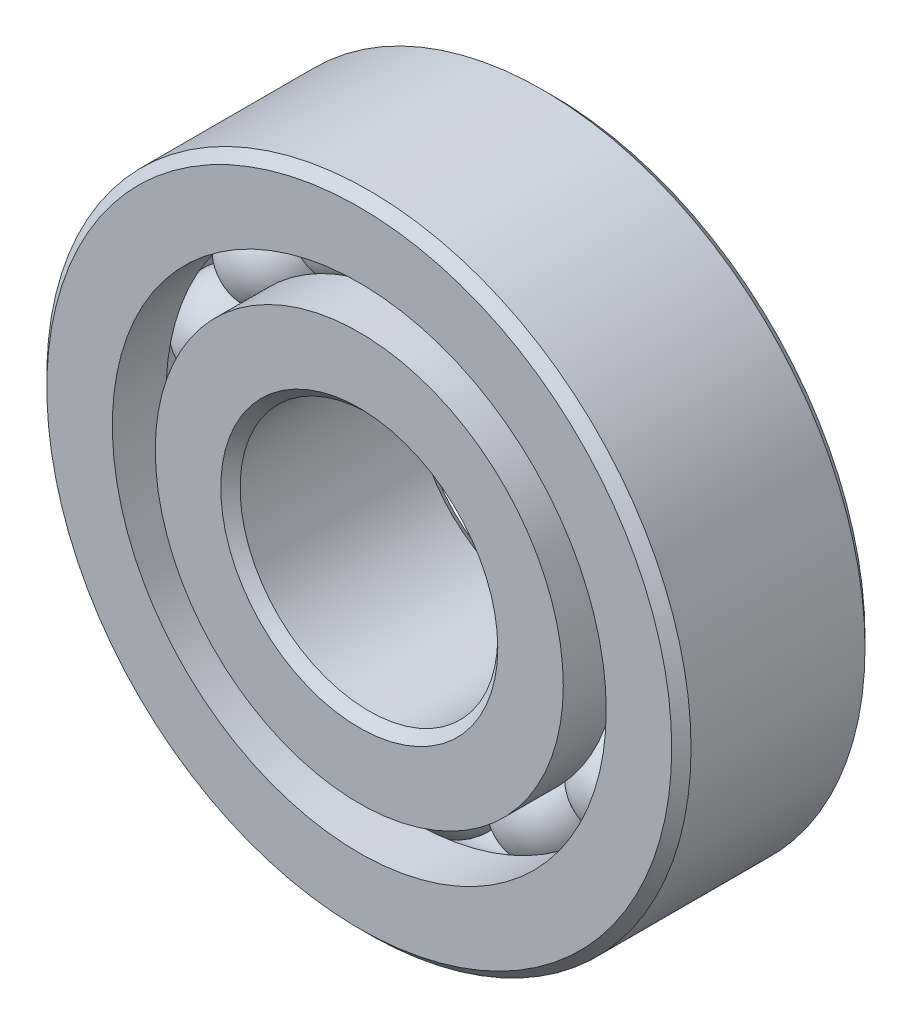
ISO-10303-21;
HEADER;
FILE_DESCRIPTION(('STEP AP214'),'2;1');
FILE_NAME('part.step','',(''),(''),'','','');
FILE_SCHEMA(('AUTOMOTIVE_DESIGN { 1 0 10303 214 1 1 1 1 }'));
ENDSEC;
DATA;
#1=APPLICATION_CONTEXT('core data for automotive mechanical design processes');
#2=APPLICATION_PROTOCOL_DEFINITION('international standard','automotive_design',2000,#1);
#3=PRODUCT_CONTEXT('',#1,'mechanical');
#4=PRODUCT('Part','Part','',(#3));
#5=PRODUCT_RELATED_PRODUCT_CATEGORY('part','',(#4));
#6=PRODUCT_DEFINITION_FORMATION('','',#4);
#7=PRODUCT_DEFINITION_CONTEXT('part definition',#1,'design');
#8=PRODUCT_DEFINITION('design','',#6,#7);
#9=PRODUCT_DEFINITION_SHAPE('','',#8);
#10=(LENGTH_UNIT() NAMED_UNIT(*) SI_UNIT(.MILLI.,.METRE.));
#11=(NAMED_UNIT(*) PLANE_ANGLE_UNIT() SI_UNIT($,.RADIAN.));
#12=(NAMED_UNIT(*) SI_UNIT($,.STERADIAN.) SOLID_ANGLE_UNIT());
#13=UNCERTAINTY_MEASURE_WITH_UNIT(LENGTH_MEASURE(1.E-05),#10,'distance_accuracy_value','');
#14=(GEOMETRIC_REPRESENTATION_CONTEXT(3) GLOBAL_UNCERTAINTY_ASSIGNED_CONTEXT((#13)) GLOBAL_UNIT_ASSIGNED_CONTEXT((#10,
#11,#12)) REPRESENTATION_CONTEXT('',''));
#15=CARTESIAN_POINT('',(0.,0.,0.));
#16=DIRECTION('',(0.,0.,1.));
#17=DIRECTION('',(1.,0.,0.));
#18=AXIS2_PLACEMENT_3D('',#15,#16,#17);
#19=CARTESIAN_POINT('',(-0.759296543455706,1.57669551882924,0.));
#20=DIRECTION('',(0.,0.,1.));
#21=DIRECTION('',(-0.433883739117546,0.900968867902425,0.));
#22=AXIS2_PLACEMENT_3D('',#19,#20,#21);
#23=SPHERICAL_SURFACE('',#22,0.372677996249965);
#24=CARTESIAN_POINT('',(-0.759296543455706,1.57669551882924,0.372677996249965));
#25=VERTEX_POINT('',#24);
#26=VERTEX_LOOP('',#25);
#27=FACE_BOUND('',#26,.T.);
#28=ADVANCED_FACE('F41',(#27),#23,.T.);
#29=CLOSED_SHELL('',(#28));
#30=MANIFOLD_SOLID_BREP('B2',#29);
#31=CARTESIAN_POINT('',(-1.36820509431904,1.0911071532528,0.));
#32=DIRECTION('',(0.,0.,1.));
#33=DIRECTION('',(-0.781831482468022,0.623489801858743,0.));
#34=AXIS2_PLACEMENT_3D('',#31,#32,#33);
#35=SPHERICAL_SURFACE('',#34,0.372677996249965);
#36=CARTESIAN_POINT('',(-1.36820509431904,1.0911071532528,0.372677996249965));
#37=VERTEX_POINT('',#36);
#38=VERTEX_LOOP('',#37);
#39=FACE_BOUND('',#38,.T.);
#40=ADVANCED_FACE('F76',(#39),#35,.T.);
#41=CLOSED_SHELL('',(#40));
#42=MANIFOLD_SOLID_BREP('B6',#41);
#43=CARTESIAN_POINT('',(-1.70612384631819,0.389411634423568,0.));
#44=DIRECTION('',(0.,0.,1.));
#45=DIRECTION('',(-0.974927912181821,0.222520933956325,0.));
#46=AXIS2_PLACEMENT_3D('',#43,#44,#45);
#47=SPHERICAL_SURFACE('',#46,0.372677996249965);
#48=CARTESIAN_POINT('',(-1.70612384631819,0.389411634423568,0.372677996249965));
#49=VERTEX_POINT('',#48);
#50=VERTEX_LOOP('',#49);
#51=FACE_BOUND('',#50,.T.);
#52=ADVANCED_FACE('F111',(#51),#47,.T.);
#53=CLOSED_SHELL('',(#52));
#54=MANIFOLD_SOLID_BREP('B37',#53);
#55=CARTESIAN_POINT('',(-1.7061238463182,-0.389411634423534,0.));
#56=DIRECTION('',(0.,0.,1.));
#57=DIRECTION('',(-0.974927912181826,-0.222520933956305,0.));
#58=AXIS2_PLACEMENT_3D('',#55,#56,#57);
#59=SPHERICAL_SURFACE('',#58,0.372677996249965);
#60=CARTESIAN_POINT('',(-1.7061238463182,-0.389411634423534,0.372677996249965));
#61=VERTEX_POINT('',#60);
#62=VERTEX_LOOP('',#61);
#63=FACE_BOUND('',#62,.T.);
#64=ADVANCED_FACE('F146',(#63),#59,.T.);
#65=CLOSED_SHELL('',(#64));
#66=MANIFOLD_SOLID_BREP('B72',#65);
#67=CARTESIAN_POINT('',(-1.36820509431906,-1.09110715325277,0.));
#68=DIRECTION('',(0.,0.,1.));
#69=DIRECTION('',(-0.781831482468035,-0.623489801858727,0.));
#70=AXIS2_PLACEMENT_3D('',#67,#68,#69);
#71=SPHERICAL_SURFACE('',#70,0.372677996249965);
#72=CARTESIAN_POINT('',(-1.36820509431906,-1.09110715325277,0.372677996249965));
#73=VERTEX_POINT('',#72);
#74=VERTEX_LOOP('',#73);
#75=FACE_BOUND('',#74,.T.);
#76=ADVANCED_FACE('F181',(#75),#71,.T.);
#77=CLOSED_SHELL('',(#76));
#78=MANIFOLD_SOLID_BREP('B107',#77);
#79=CARTESIAN_POINT('',(-0.759296543455739,-1.57669551882923,0.));
#80=DIRECTION('',(0.,0.,1.));
#81=DIRECTION('',(-0.433883739117565,-0.900968867902416,0.));
#82=AXIS2_PLACEMENT_3D('',#79,#80,#81);
#83=SPHERICAL_SURFACE('',#82,0.372677996249965);
#84=CARTESIAN_POINT('',(-0.759296543455739,-1.57669551882923,0.372677996249965));
#85=VERTEX_POINT('',#84);
#86=VERTEX_LOOP('',#85);
#87=FACE_BOUND('',#86,.T.);
#88=ADVANCED_FACE('F216',(#87),#83,.T.);
#89=CLOSED_SHELL('',(#88));
#90=MANIFOLD_SOLID_BREP('B142',#89);
#91=CARTESIAN_POINT('',(0.,-1.75,0.));
#92=DIRECTION('',(0.,0.,1.));
#93=DIRECTION('',(0.,-1.,0.));
#94=AXIS2_PLACEMENT_3D('',#91,#92,#93);
#95=SPHERICAL_SURFACE('',#94,0.372677996249965);
#96=CARTESIAN_POINT('',(0.,-1.75,0.372677996249965));
#97=VERTEX_POINT('',#96);
#98=VERTEX_LOOP('',#97);
#99=FACE_BOUND('',#98,.T.);
#100=ADVANCED_FACE('F251',(#99),#95,.T.);
#101=CLOSED_SHELL('',(#100));
#102=MANIFOLD_SOLID_BREP('B177',#101);
#103=CARTESIAN_POINT('',(0.759296543455717,-1.57669551882924,0.));
#104=DIRECTION('',(0.,0.,1.));
#105=DIRECTION('',(0.433883739117553,-0.900968867902422,0.));
#106=AXIS2_PLACEMENT_3D('',#103,#104,#105);
#107=SPHERICAL_SURFACE('',#106,0.372677996249965);
#108=CARTESIAN_POINT('',(0.759296543455717,-1.57669551882924,0.372677996249965));
#109=VERTEX_POINT('',#108);
#110=VERTEX_LOOP('',#109);
#111=FACE_BOUND('',#110,.T.);
#112=ADVANCED_FACE('F286',(#111),#107,.T.);
#113=CLOSED_SHELL('',(#112));
#114=MANIFOLD_SOLID_BREP('B212',#113);
#115=CARTESIAN_POINT('',(1.36820509431905,-1.09110715325279,0.));
#116=DIRECTION('',(0.,0.,1.));
#117=DIRECTION('',(0.781831482468027,-0.623489801858737,0.));
#118=AXIS2_PLACEMENT_3D('',#115,#116,#117);
#119=SPHERICAL_SURFACE('',#118,0.372677996249965);
#120=CARTESIAN_POINT('',(1.36820509431905,-1.09110715325279,0.372677996249965));
#121=VERTEX_POINT('',#120);
#122=VERTEX_LOOP('',#121);
#123=FACE_BOUND('',#122,.T.);
#124=ADVANCED_FACE('F321',(#123),#119,.T.);
#125=CLOSED_SHELL('',(#124));
#126=MANIFOLD_SOLID_BREP('B247',#125);
#127=CARTESIAN_POINT('',(1.70612384631819,-0.389411634423557,0.));
#128=DIRECTION('',(0.,0.,1.));
#129=DIRECTION('',(0.974927912181823,-0.222520933956318,0.));
#130=AXIS2_PLACEMENT_3D('',#127,#128,#129);
#131=SPHERICAL_SURFACE('',#130,0.372677996249965);
#132=CARTESIAN_POINT('',(1.70612384631819,-0.389411634423557,0.372677996249965));
#133=VERTEX_POINT('',#132);
#134=VERTEX_LOOP('',#133);
#135=FACE_BOUND('',#134,.T.);
#136=ADVANCED_FACE('F356',(#135),#131,.T.);
#137=CLOSED_SHELL('',(#136));
#138=MANIFOLD_SOLID_BREP('B282',#137);
#139=CARTESIAN_POINT('',(1.70612384631819,0.389411634423545,0.));
#140=DIRECTION('',(0.,0.,1.));
#141=DIRECTION('',(0.974927912181824,0.222520933956311,0.));
#142=AXIS2_PLACEMENT_3D('',#139,#140,#141);
#143=SPHERICAL_SURFACE('',#142,0.372677996249965);
#144=CARTESIAN_POINT('',(1.70612384631819,0.389411634423545,0.372677996249965));
#145=VERTEX_POINT('',#144);
#146=VERTEX_LOOP('',#145);
#147=FACE_BOUND('',#146,.T.);
#148=ADVANCED_FACE('F391',(#147),#143,.T.);
#149=CLOSED_SHELL('',(#148));
#150=MANIFOLD_SOLID_BREP('B317',#149);
#151=CARTESIAN_POINT('',(1.36820509431905,1.09110715325278,0.));
#152=DIRECTION('',(0.,0.,1.));
#153=DIRECTION('',(0.781831482468031,0.623489801858732,0.));
#154=AXIS2_PLACEMENT_3D('',#151,#152,#153);
#155=SPHERICAL_SURFACE('',#154,0.372677996249965);
#156=CARTESIAN_POINT('',(1.36820509431905,1.09110715325278,0.372677996249965));
#157=VERTEX_POINT('',#156);
#158=VERTEX_LOOP('',#157);
#159=FACE_BOUND('',#158,.T.);
#160=ADVANCED_FACE('F426',(#159),#155,.T.);
#161=CLOSED_SHELL('',(#160));
#162=MANIFOLD_SOLID_BREP('B352',#161);
#163=CARTESIAN_POINT('',(0.759296543455728,1.57669551882923,0.));
#164=DIRECTION('',(0.,0.,1.));
#165=DIRECTION('',(0.433883739117559,0.900968867902419,0.));
#166=AXIS2_PLACEMENT_3D('',#163,#164,#165);
#167=SPHERICAL_SURFACE('',#166,0.372677996249965);
#168=CARTESIAN_POINT('',(0.759296543455728,1.57669551882923,0.372677996249965));
#169=VERTEX_POINT('',#168);
#170=VERTEX_LOOP('',#169);
#171=FACE_BOUND('',#170,.T.);
#172=ADVANCED_FACE('F461',(#171),#167,.T.);
#173=CLOSED_SHELL('',(#172));
#174=MANIFOLD_SOLID_BREP('B387',#173);
#175=CARTESIAN_POINT('',(0.,1.75,0.));
#176=DIRECTION('',(0.,0.,1.));
#177=DIRECTION('',(0.,1.,0.));
#178=AXIS2_PLACEMENT_3D('',#175,#176,#177);
#179=SPHERICAL_SURFACE('',#178,0.372677996249965);
#180=CARTESIAN_POINT('',(0.,1.75,0.372677996249965));
#181=VERTEX_POINT('',#180);
#182=VERTEX_LOOP('',#181);
#183=FACE_BOUND('',#182,.T.);
#184=ADVANCED_FACE('F498',(#183),#179,.T.);
#185=CLOSED_SHELL('',(#184));
#186=MANIFOLD_SOLID_BREP('B422',#185);
#187=CARTESIAN_POINT('',(0.,1.58333333333333,0.75));
#188=DIRECTION('',(0.,0.,-1.));
#189=DIRECTION('',(-1.,0.,0.));
#190=AXIS2_PLACEMENT_3D('',#187,#188,#189);
#191=PLANE('',#190);
#192=CARTESIAN_POINT('',(0.,0.,0.75));
#193=DIRECTION('',(0.,0.,1.));
#194=DIRECTION('',(1.,0.,0.));
#195=AXIS2_PLACEMENT_3D('',#192,#193,#194);
#196=CIRCLE('',#195,1.075);
#197=CARTESIAN_POINT('',(1.075,0.,0.75));
#198=VERTEX_POINT('',#197);
#199=EDGE_CURVE('E497',#198,#198,#196,.T.);
#200=ORIENTED_EDGE('',*,*,#199,.F.);
#201=EDGE_LOOP('',(#200));
#202=FACE_BOUND('',#201,.T.);
#203=CARTESIAN_POINT('',(0.,0.,0.750000000000001));
#204=DIRECTION('',(0.,0.,1.));
#205=DIRECTION('',(1.,0.,0.));
#206=AXIS2_PLACEMENT_3D('',#203,#204,#205);
#207=CIRCLE('',#206,1.58333333333333);
#208=CARTESIAN_POINT('',(1.58333333333333,0.,0.750000000000001));
#209=VERTEX_POINT('',#208);
#210=EDGE_CURVE('E545',#209,#209,#207,.T.);
#211=ORIENTED_EDGE('',*,*,#210,.T.);
#212=EDGE_LOOP('',(#211));
#213=FACE_BOUND('',#212,.T.);
#214=ADVANCED_FACE('F517',(#202,#213),#191,.F.);
#215=CARTESIAN_POINT('',(0.,0.,0.75));
#216=DIRECTION('',(0.,0.,1.));
#217=DIRECTION('',(1.,0.,0.));
#218=AXIS2_PLACEMENT_3D('',#215,#216,#217);
#219=CONICAL_SURFACE('',#218,1.075,0.785398163397447);
#220=CARTESIAN_POINT('',(0.,0.,0.675));
#221=DIRECTION('',(0.,0.,1.));
#222=DIRECTION('',(1.,0.,0.));
#223=AXIS2_PLACEMENT_3D('',#220,#221,#222);
#224=CIRCLE('',#223,1.);
#225=CARTESIAN_POINT('',(1.,0.,0.675));
#226=VERTEX_POINT('',#225);
#227=EDGE_CURVE('E523',#226,#226,#224,.T.);
#228=ORIENTED_EDGE('',*,*,#227,.F.);
#229=EDGE_LOOP('',(#228));
#230=FACE_BOUND('',#229,.T.);
#231=ORIENTED_EDGE('',*,*,#199,.T.);
#232=EDGE_LOOP('',(#231));
#233=FACE_BOUND('',#232,.T.);
#234=ADVANCED_FACE('F582',(#230,#233),#219,.F.);
#235=CARTESIAN_POINT('',(0.,0.,0.75));
#236=DIRECTION('',(0.,0.,1.));
#237=DIRECTION('',(1.,0.,0.));
#238=AXIS2_PLACEMENT_3D('',#235,#236,#237);
#239=CYLINDRICAL_SURFACE('',#238,1.);
#240=CARTESIAN_POINT('',(0.,0.,-0.675));
#241=DIRECTION('',(0.,0.,1.));
#242=DIRECTION('',(1.,0.,0.));
#243=AXIS2_PLACEMENT_3D('',#240,#241,#242);
#244=CIRCLE('',#243,1.);
#245=CARTESIAN_POINT('',(1.,0.,-0.675));
#246=VERTEX_POINT('',#245);
#247=EDGE_CURVE('E527',#246,#246,#244,.T.);
#248=ORIENTED_EDGE('',*,*,#247,.F.);
#249=EDGE_LOOP('',(#248));
#250=FACE_BOUND('',#249,.T.);
#251=ORIENTED_EDGE('',*,*,#227,.T.);
#252=EDGE_LOOP('',(#251));
#253=FACE_BOUND('',#252,.T.);
#254=ADVANCED_FACE('F577',(#250,#253),#239,.F.);
#255=CARTESIAN_POINT('',(0.,0.,-0.675));
#256=DIRECTION('',(0.,0.,-1.));
#257=DIRECTION('',(-1.,0.,0.));
#258=AXIS2_PLACEMENT_3D('',#255,#256,#257);
#259=CONICAL_SURFACE('',#258,1.,0.785398163397447);
#260=CARTESIAN_POINT('',(0.,0.,-0.75));
#261=DIRECTION('',(0.,0.,1.));
#262=DIRECTION('',(1.,0.,0.));
#263=AXIS2_PLACEMENT_3D('',#260,#261,#262);
#264=CIRCLE('',#263,1.075);
#265=CARTESIAN_POINT('',(1.075,0.,-0.75));
#266=VERTEX_POINT('',#265);
#267=EDGE_CURVE('E531',#266,#266,#264,.T.);
#268=ORIENTED_EDGE('',*,*,#267,.F.);
#269=EDGE_LOOP('',(#268));
#270=FACE_BOUND('',#269,.T.);
#271=ORIENTED_EDGE('',*,*,#247,.T.);
#272=EDGE_LOOP('',(#271));
#273=FACE_BOUND('',#272,.T.);
#274=ADVANCED_FACE('F571',(#270,#273),#259,.F.);
#275=CARTESIAN_POINT('',(0.,1.58333333333333,-0.75));
#276=DIRECTION('',(0.,0.,1.));
#277=DIRECTION('',(1.,0.,0.));
#278=AXIS2_PLACEMENT_3D('',#275,#276,#277);
#279=PLANE('',#278);
#280=CARTESIAN_POINT('',(0.,0.,-0.75));
#281=DIRECTION('',(0.,0.,1.));
#282=DIRECTION('',(1.,0.,0.));
#283=AXIS2_PLACEMENT_3D('',#280,#281,#282);
#284=CIRCLE('',#283,1.58333333333333);
#285=CARTESIAN_POINT('',(1.58333333333333,0.,-0.75));
#286=VERTEX_POINT('',#285);
#287=EDGE_CURVE('E536',#286,#286,#284,.T.);
#288=ORIENTED_EDGE('',*,*,#287,.F.);
#289=EDGE_LOOP('',(#288));
#290=FACE_BOUND('',#289,.T.);
#291=ORIENTED_EDGE('',*,*,#267,.T.);
#292=EDGE_LOOP('',(#291));
#293=FACE_BOUND('',#292,.T.);
#294=ADVANCED_FACE('F565',(#290,#293),#279,.F.);
#295=CARTESIAN_POINT('',(0.,0.,0.75));
#296=DIRECTION('',(0.,0.,1.));
#297=DIRECTION('',(1.,0.,0.));
#298=AXIS2_PLACEMENT_3D('',#295,#296,#297);
#299=CYLINDRICAL_SURFACE('',#298,1.58333333333333);
#300=CARTESIAN_POINT('',(0.,0.,-0.333333333333333));
#301=DIRECTION('',(0.,0.,1.));
#302=DIRECTION('',(1.,0.,0.));
#303=AXIS2_PLACEMENT_3D('',#300,#301,#302);
#304=CIRCLE('',#303,1.58333333333333);
#305=CARTESIAN_POINT('',(1.58333333333333,0.,-0.333333333333333));
#306=VERTEX_POINT('',#305);
#307=EDGE_CURVE('E539',#306,#306,#304,.T.);
#308=ORIENTED_EDGE('',*,*,#307,.F.);
#309=EDGE_LOOP('',(#308));
#310=FACE_BOUND('',#309,.T.);
#311=ORIENTED_EDGE('',*,*,#287,.T.);
#312=EDGE_LOOP('',(#311));
#313=FACE_BOUND('',#312,.T.);
#314=ADVANCED_FACE('F559',(#310,#313),#299,.T.);
#315=CARTESIAN_POINT('',(0.,0.,0.));
#316=DIRECTION('',(0.,0.,1.));
#317=DIRECTION('',(1.,0.,0.));
#318=AXIS2_PLACEMENT_3D('',#315,#316,#317);
#319=TOROIDAL_SURFACE('',#318,1.75,0.372677996249965);
#320=CARTESIAN_POINT('',(0.,0.,0.333333333333333));
#321=DIRECTION('',(0.,0.,1.));
#322=DIRECTION('',(1.,0.,0.));
#323=AXIS2_PLACEMENT_3D('',#320,#321,#322);
#324=CIRCLE('',#323,1.58333333333333);
#325=CARTESIAN_POINT('',(1.58333333333333,0.,0.333333333333333));
#326=VERTEX_POINT('',#325);
#327=EDGE_CURVE('E542',#326,#326,#324,.T.);
#328=ORIENTED_EDGE('',*,*,#327,.F.);
#329=EDGE_LOOP('',(#328));
#330=FACE_BOUND('',#329,.T.);
#331=ORIENTED_EDGE('',*,*,#307,.T.);
#332=EDGE_LOOP('',(#331));
#333=FACE_BOUND('',#332,.T.);
#334=ADVANCED_FACE('F553',(#330,#333),#319,.F.);
#335=CARTESIAN_POINT('',(0.,0.,0.75));
#336=DIRECTION('',(0.,0.,1.));
#337=DIRECTION('',(1.,0.,0.));
#338=AXIS2_PLACEMENT_3D('',#335,#336,#337);
#339=CYLINDRICAL_SURFACE('',#338,1.58333333333333);
#340=ORIENTED_EDGE('',*,*,#210,.F.);
#341=EDGE_LOOP('',(#340));
#342=FACE_BOUND('',#341,.T.);
#343=ORIENTED_EDGE('',*,*,#327,.T.);
#344=EDGE_LOOP('',(#343));
#345=FACE_BOUND('',#344,.T.);
#346=ADVANCED_FACE('F550',(#342,#345),#339,.T.);
#347=CLOSED_SHELL('',(#214,#234,#254,#274,#294,#314,#334,#346));
#348=MANIFOLD_SOLID_BREP('B457',#347);
#349=CARTESIAN_POINT('',(0.,0.,0.675));
#350=DIRECTION('',(0.,0.,-1.));
#351=DIRECTION('',(-1.,0.,0.));
#352=AXIS2_PLACEMENT_3D('',#349,#350,#351);
#353=CONICAL_SURFACE('',#352,2.5,0.785398163397448);
#354=CARTESIAN_POINT('',(0.,0.,0.75));
#355=DIRECTION('',(0.,0.,1.));
#356=DIRECTION('',(1.,0.,0.));
#357=AXIS2_PLACEMENT_3D('',#354,#355,#356);
#358=CIRCLE('',#357,2.425);
#359=CARTESIAN_POINT('',(2.425,0.,0.75));
#360=VERTEX_POINT('',#359);
#361=EDGE_CURVE('E666',#360,#360,#358,.T.);
#362=ORIENTED_EDGE('',*,*,#361,.F.);
#363=EDGE_LOOP('',(#362));
#364=FACE_BOUND('',#363,.T.);
#365=CARTESIAN_POINT('',(0.,0.,0.675));
#366=DIRECTION('',(0.,0.,1.));
#367=DIRECTION('',(1.,0.,0.));
#368=AXIS2_PLACEMENT_3D('',#365,#366,#367);
#369=CIRCLE('',#368,2.5);
#370=CARTESIAN_POINT('',(2.5,0.,0.675));
#371=VERTEX_POINT('',#370);
#372=EDGE_CURVE('E516',#371,#371,#369,.T.);
#373=ORIENTED_EDGE('',*,*,#372,.T.);
#374=EDGE_LOOP('',(#373));
#375=FACE_BOUND('',#374,.T.);
#376=ADVANCED_FACE('F638',(#364,#375),#353,.T.);
#377=CARTESIAN_POINT('',(0.,0.,0.75));
#378=DIRECTION('',(0.,0.,1.));
#379=DIRECTION('',(1.,0.,0.));
#380=AXIS2_PLACEMENT_3D('',#377,#378,#379);
#381=CYLINDRICAL_SURFACE('',#380,2.5);
#382=ORIENTED_EDGE('',*,*,#372,.F.);
#383=EDGE_LOOP('',(#382));
#384=FACE_BOUND('',#383,.T.);
#385=CARTESIAN_POINT('',(0.,0.,-0.675));
#386=DIRECTION('',(0.,0.,1.));
#387=DIRECTION('',(1.,0.,0.));
#388=AXIS2_PLACEMENT_3D('',#385,#386,#387);
#389=CIRCLE('',#388,2.5);
#390=CARTESIAN_POINT('',(2.5,0.,-0.675));
#391=VERTEX_POINT('',#390);
#392=EDGE_CURVE('E644',#391,#391,#389,.T.);
#393=ORIENTED_EDGE('',*,*,#392,.T.);
#394=EDGE_LOOP('',(#393));
#395=FACE_BOUND('',#394,.T.);
#396=ADVANCED_FACE('F673',(#384,#395),#381,.T.);
#397=CARTESIAN_POINT('',(0.,0.,-0.750000000000001));
#398=DIRECTION('',(0.,0.,1.));
#399=DIRECTION('',(1.,0.,0.));
#400=AXIS2_PLACEMENT_3D('',#397,#398,#399);
#401=CONICAL_SURFACE('',#400,2.425,0.785398163397447);
#402=ORIENTED_EDGE('',*,*,#392,.F.);
#403=EDGE_LOOP('',(#402));
#404=FACE_BOUND('',#403,.T.);
#405=CARTESIAN_POINT('',(0.,0.,-0.750000000000001));
#406=DIRECTION('',(0.,0.,1.));
#407=DIRECTION('',(1.,0.,0.));
#408=AXIS2_PLACEMENT_3D('',#405,#406,#407);
#409=CIRCLE('',#408,2.425);
#410=CARTESIAN_POINT('',(2.425,0.,-0.750000000000001));
#411=VERTEX_POINT('',#410);
#412=EDGE_CURVE('E648',#411,#411,#409,.T.);
#413=ORIENTED_EDGE('',*,*,#412,.T.);
#414=EDGE_LOOP('',(#413));
#415=FACE_BOUND('',#414,.T.);
#416=ADVANCED_FACE('F677',(#404,#415),#401,.T.);
#417=CARTESIAN_POINT('',(0.,2.425,-0.750000000000001));
#418=DIRECTION('',(0.,0.,1.));
#419=DIRECTION('',(1.,0.,0.));
#420=AXIS2_PLACEMENT_3D('',#417,#418,#419);
#421=PLANE('',#420);
#422=ORIENTED_EDGE('',*,*,#412,.F.);
#423=EDGE_LOOP('',(#422));
#424=FACE_BOUND('',#423,.T.);
#425=CARTESIAN_POINT('',(0.,0.,-0.75));
#426=DIRECTION('',(0.,0.,1.));
#427=DIRECTION('',(1.,0.,0.));
#428=AXIS2_PLACEMENT_3D('',#425,#426,#427);
#429=CIRCLE('',#428,1.91666666666667);
#430=CARTESIAN_POINT('',(1.91666666666667,0.,-0.75));
#431=VERTEX_POINT('',#430);
#432=EDGE_CURVE('E652',#431,#431,#429,.T.);
#433=ORIENTED_EDGE('',*,*,#432,.T.);
#434=EDGE_LOOP('',(#433));
#435=FACE_BOUND('',#434,.T.);
#436=ADVANCED_FACE('F682',(#424,#435),#421,.F.);
#437=CARTESIAN_POINT('',(0.,0.,0.75));
#438=DIRECTION('',(0.,0.,1.));
#439=DIRECTION('',(1.,0.,0.));
#440=AXIS2_PLACEMENT_3D('',#437,#438,#439);
#441=CYLINDRICAL_SURFACE('',#440,1.91666666666667);
#442=ORIENTED_EDGE('',*,*,#432,.F.);
#443=EDGE_LOOP('',(#442));
#444=FACE_BOUND('',#443,.T.);
#445=CARTESIAN_POINT('',(0.,0.,-0.333333333333333));
#446=DIRECTION('',(0.,0.,1.));
#447=DIRECTION('',(1.,0.,0.));
#448=AXIS2_PLACEMENT_3D('',#445,#446,#447);
#449=CIRCLE('',#448,1.91666666666667);
#450=CARTESIAN_POINT('',(1.91666666666667,0.,-0.333333333333333));
#451=VERTEX_POINT('',#450);
#452=EDGE_CURVE('E657',#451,#451,#449,.T.);
#453=ORIENTED_EDGE('',*,*,#452,.T.);
#454=EDGE_LOOP('',(#453));
#455=FACE_BOUND('',#454,.T.);
#456=ADVANCED_FACE('F688',(#444,#455),#441,.F.);
#457=CARTESIAN_POINT('',(0.,0.,0.));
#458=DIRECTION('',(0.,0.,1.));
#459=DIRECTION('',(1.,0.,0.));
#460=AXIS2_PLACEMENT_3D('',#457,#458,#459);
#461=TOROIDAL_SURFACE('',#460,1.75,0.372677996249965);
#462=ORIENTED_EDGE('',*,*,#452,.F.);
#463=EDGE_LOOP('',(#462));
#464=FACE_BOUND('',#463,.T.);
#465=CARTESIAN_POINT('',(0.,0.,0.333333333333333));
#466=DIRECTION('',(0.,0.,1.));
#467=DIRECTION('',(1.,0.,0.));
#468=AXIS2_PLACEMENT_3D('',#465,#466,#467);
#469=CIRCLE('',#468,1.91666666666667);
#470=CARTESIAN_POINT('',(1.91666666666667,0.,0.333333333333333));
#471=VERTEX_POINT('',#470);
#472=EDGE_CURVE('E660',#471,#471,#469,.T.);
#473=ORIENTED_EDGE('',*,*,#472,.T.);
#474=EDGE_LOOP('',(#473));
#475=FACE_BOUND('',#474,.T.);
#476=ADVANCED_FACE('F692',(#464,#475),#461,.F.);
#477=CARTESIAN_POINT('',(0.,0.,0.75));
#478=DIRECTION('',(0.,0.,1.));
#479=DIRECTION('',(1.,0.,0.));
#480=AXIS2_PLACEMENT_3D('',#477,#478,#479);
#481=CYLINDRICAL_SURFACE('',#480,1.91666666666667);
#482=ORIENTED_EDGE('',*,*,#472,.F.);
#483=EDGE_LOOP('',(#482));
#484=FACE_BOUND('',#483,.T.);
#485=CARTESIAN_POINT('',(0.,0.,0.75));
#486=DIRECTION('',(0.,0.,1.));
#487=DIRECTION('',(1.,0.,0.));
#488=AXIS2_PLACEMENT_3D('',#485,#486,#487);
#489=CIRCLE('',#488,1.91666666666667);
#490=CARTESIAN_POINT('',(1.91666666666667,0.,0.75));
#491=VERTEX_POINT('',#490);
#492=EDGE_CURVE('E663',#491,#491,#489,.T.);
#493=ORIENTED_EDGE('',*,*,#492,.T.);
#494=EDGE_LOOP('',(#493));
#495=FACE_BOUND('',#494,.T.);
#496=ADVANCED_FACE('F696',(#484,#495),#481,.F.);
#497=CARTESIAN_POINT('',(0.,2.425,0.75));
#498=DIRECTION('',(0.,0.,-1.));
#499=DIRECTION('',(-1.,0.,0.));
#500=AXIS2_PLACEMENT_3D('',#497,#498,#499);
#501=PLANE('',#500);
#502=ORIENTED_EDGE('',*,*,#492,.F.);
#503=EDGE_LOOP('',(#502));
#504=FACE_BOUND('',#503,.T.);
#505=ORIENTED_EDGE('',*,*,#361,.T.);
#506=EDGE_LOOP('',(#505));
#507=FACE_BOUND('',#506,.T.);
#508=ADVANCED_FACE('F670',(#504,#507),#501,.F.);
#509=CLOSED_SHELL('',(#376,#396,#416,#436,#456,#476,#496,#508));
#510=MANIFOLD_SOLID_BREP('B492',#509);
#511=ADVANCED_BREP_SHAPE_REPRESENTATION('',(#18,#30,#42,#54,#66,#78,#90,#102,#114,#126,#138,
#150,#162,#174,#186,#348,#510),#14);
#512=SHAPE_DEFINITION_REPRESENTATION(#9,#511);
ENDSEC;
END-ISO-10303-21;
